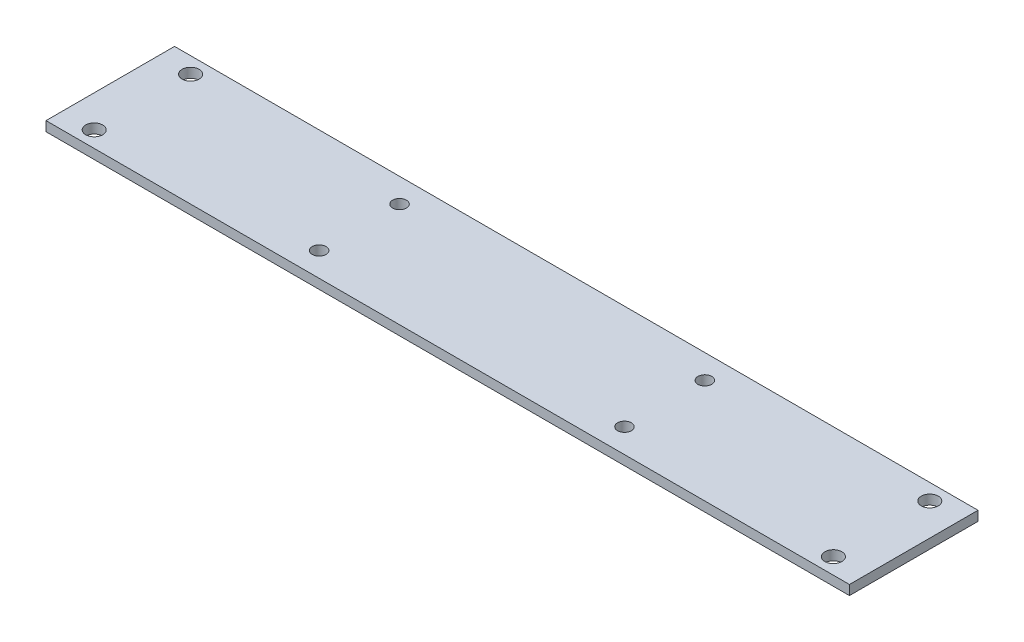
ISO-10303-21;
HEADER;
FILE_DESCRIPTION(('STEP AP214'),'2;1');
FILE_NAME('part.step','',(''),(''),'','','');
FILE_SCHEMA(('AUTOMOTIVE_DESIGN { 1 0 10303 214 1 1 1 1 }'));
ENDSEC;
DATA;
#1=APPLICATION_CONTEXT('core data for automotive mechanical design processes');
#2=APPLICATION_PROTOCOL_DEFINITION('international standard','automotive_design',2000,#1);
#3=PRODUCT_CONTEXT('',#1,'mechanical');
#4=PRODUCT('Part','Part','',(#3));
#5=PRODUCT_RELATED_PRODUCT_CATEGORY('part','',(#4));
#6=PRODUCT_DEFINITION_FORMATION('','',#4);
#7=PRODUCT_DEFINITION_CONTEXT('part definition',#1,'design');
#8=PRODUCT_DEFINITION('design','',#6,#7);
#9=PRODUCT_DEFINITION_SHAPE('','',#8);
#10=(LENGTH_UNIT() NAMED_UNIT(*) SI_UNIT(.MILLI.,.METRE.));
#11=(NAMED_UNIT(*) PLANE_ANGLE_UNIT() SI_UNIT($,.RADIAN.));
#12=(NAMED_UNIT(*) SI_UNIT($,.STERADIAN.) SOLID_ANGLE_UNIT());
#13=UNCERTAINTY_MEASURE_WITH_UNIT(LENGTH_MEASURE(1.E-05),#10,'distance_accuracy_value','');
#14=(GEOMETRIC_REPRESENTATION_CONTEXT(3) GLOBAL_UNCERTAINTY_ASSIGNED_CONTEXT((#13)) GLOBAL_UNIT_ASSIGNED_CONTEXT((#10,
#11,#12)) REPRESENTATION_CONTEXT('',''));
#15=CARTESIAN_POINT('',(0.,0.,0.));
#16=DIRECTION('',(0.,0.,1.));
#17=DIRECTION('',(1.,0.,0.));
#18=AXIS2_PLACEMENT_3D('',#15,#16,#17);
#19=CARTESIAN_POINT('',(0.,3.,0.));
#20=DIRECTION('',(0.,1.,0.));
#21=DIRECTION('',(0.,0.,1.));
#22=AXIS2_PLACEMENT_3D('',#19,#20,#21);
#23=PLANE('',#22);
#24=CARTESIAN_POINT('',(-115.,3.,15.));
#25=DIRECTION('',(0.,1.,0.));
#26=DIRECTION('',(0.,0.,-1.));
#27=AXIS2_PLACEMENT_3D('',#24,#25,#26);
#28=CIRCLE('',#27,2.65);
#29=CARTESIAN_POINT('',(-115.,3.,12.35));
#30=VERTEX_POINT('',#29);
#31=EDGE_CURVE('E174',#30,#30,#28,.T.);
#32=ORIENTED_EDGE('',*,*,#31,.F.);
#33=EDGE_LOOP('',(#32));
#34=FACE_BOUND('',#33,.T.);
#35=CARTESIAN_POINT('',(-115.,3.,-15.));
#36=DIRECTION('',(0.,1.,0.));
#37=DIRECTION('',(0.,0.,1.));
#38=AXIS2_PLACEMENT_3D('',#35,#36,#37);
#39=CIRCLE('',#38,2.65);
#40=CARTESIAN_POINT('',(-115.,3.,-12.35));
#41=VERTEX_POINT('',#40);
#42=EDGE_CURVE('E158',#41,#41,#39,.T.);
#43=ORIENTED_EDGE('',*,*,#42,.F.);
#44=EDGE_LOOP('',(#43));
#45=FACE_BOUND('',#44,.T.);
#46=CARTESIAN_POINT('',(47.5,3.,12.5));
#47=DIRECTION('',(0.,1.,0.));
#48=DIRECTION('',(0.,0.,1.));
#49=AXIS2_PLACEMENT_3D('',#46,#47,#48);
#50=CIRCLE('',#49,2.15);
#51=CARTESIAN_POINT('',(47.5,3.,14.65));
#52=VERTEX_POINT('',#51);
#53=EDGE_CURVE('E142',#52,#52,#50,.T.);
#54=ORIENTED_EDGE('',*,*,#53,.F.);
#55=EDGE_LOOP('',(#54));
#56=FACE_BOUND('',#55,.T.);
#57=CARTESIAN_POINT('',(-47.5,3.,-12.5));
#58=DIRECTION('',(0.,1.,0.));
#59=DIRECTION('',(0.,0.,1.));
#60=AXIS2_PLACEMENT_3D('',#57,#58,#59);
#61=CIRCLE('',#60,2.15);
#62=CARTESIAN_POINT('',(-47.5,3.,-10.35));
#63=VERTEX_POINT('',#62);
#64=EDGE_CURVE('E112',#63,#63,#61,.T.);
#65=ORIENTED_EDGE('',*,*,#64,.F.);
#66=EDGE_LOOP('',(#65));
#67=FACE_BOUND('',#66,.T.);
#68=DIRECTION('',(0.,0.,-1.));
#69=VECTOR('',#68,1.);
#70=CARTESIAN_POINT('',(125.,3.,-20.));
#71=LINE('',#70,#69);
#72=CARTESIAN_POINT('',(125.,3.,20.));
#73=VERTEX_POINT('',#72);
#74=CARTESIAN_POINT('',(125.,3.,-20.));
#75=VERTEX_POINT('',#74);
#76=EDGE_CURVE('E92',#73,#75,#71,.T.);
#77=ORIENTED_EDGE('',*,*,#76,.T.);
#78=DIRECTION('',(-1.,0.,0.));
#79=VECTOR('',#78,1.);
#80=CARTESIAN_POINT('',(-125.,3.,-20.));
#81=LINE('',#80,#79);
#82=CARTESIAN_POINT('',(-125.,3.,-20.));
#83=VERTEX_POINT('',#82);
#84=EDGE_CURVE('E87',#75,#83,#81,.T.);
#85=ORIENTED_EDGE('',*,*,#84,.T.);
#86=DIRECTION('',(0.,0.,1.));
#87=VECTOR('',#86,1.);
#88=CARTESIAN_POINT('',(-125.,3.,-20.));
#89=LINE('',#88,#87);
#90=CARTESIAN_POINT('',(-125.,3.,20.));
#91=VERTEX_POINT('',#90);
#92=EDGE_CURVE('E90',#83,#91,#89,.T.);
#93=ORIENTED_EDGE('',*,*,#92,.T.);
#94=DIRECTION('',(1.,0.,0.));
#95=VECTOR('',#94,1.);
#96=CARTESIAN_POINT('',(-125.,3.,20.));
#97=LINE('',#96,#95);
#98=EDGE_CURVE('E57',#91,#73,#97,.T.);
#99=ORIENTED_EDGE('',*,*,#98,.T.);
#100=EDGE_LOOP('',(#77,#85,#93,#99));
#101=FACE_BOUND('',#100,.T.);
#102=CARTESIAN_POINT('',(47.5,3.,-12.5));
#103=DIRECTION('',(0.,1.,0.));
#104=DIRECTION('',(0.,0.,-1.));
#105=AXIS2_PLACEMENT_3D('',#102,#103,#104);
#106=CIRCLE('',#105,2.15);
#107=CARTESIAN_POINT('',(47.5,3.,-14.65));
#108=VERTEX_POINT('',#107);
#109=EDGE_CURVE('E134',#108,#108,#106,.T.);
#110=ORIENTED_EDGE('',*,*,#109,.F.);
#111=EDGE_LOOP('',(#110));
#112=FACE_BOUND('',#111,.T.);
#113=CARTESIAN_POINT('',(-47.5,3.,12.5));
#114=DIRECTION('',(0.,1.,0.));
#115=DIRECTION('',(0.,0.,-1.));
#116=AXIS2_PLACEMENT_3D('',#113,#114,#115);
#117=CIRCLE('',#116,2.15);
#118=CARTESIAN_POINT('',(-47.5,3.,10.35));
#119=VERTEX_POINT('',#118);
#120=EDGE_CURVE('E150',#119,#119,#117,.T.);
#121=ORIENTED_EDGE('',*,*,#120,.F.);
#122=EDGE_LOOP('',(#121));
#123=FACE_BOUND('',#122,.T.);
#124=CARTESIAN_POINT('',(115.,3.,-15.));
#125=DIRECTION('',(0.,1.,0.));
#126=DIRECTION('',(0.,0.,-1.));
#127=AXIS2_PLACEMENT_3D('',#124,#125,#126);
#128=CIRCLE('',#127,2.65);
#129=CARTESIAN_POINT('',(115.,3.,-17.65));
#130=VERTEX_POINT('',#129);
#131=EDGE_CURVE('E166',#130,#130,#128,.T.);
#132=ORIENTED_EDGE('',*,*,#131,.F.);
#133=EDGE_LOOP('',(#132));
#134=FACE_BOUND('',#133,.T.);
#135=CARTESIAN_POINT('',(115.,3.,15.));
#136=DIRECTION('',(0.,1.,0.));
#137=DIRECTION('',(0.,0.,1.));
#138=AXIS2_PLACEMENT_3D('',#135,#136,#137);
#139=CIRCLE('',#138,2.65);
#140=CARTESIAN_POINT('',(115.,3.,17.65));
#141=VERTEX_POINT('',#140);
#142=EDGE_CURVE('E182',#141,#141,#139,.T.);
#143=ORIENTED_EDGE('',*,*,#142,.F.);
#144=EDGE_LOOP('',(#143));
#145=FACE_BOUND('',#144,.T.);
#146=ADVANCED_FACE('F39',(#34,#45,#56,#67,#101,#112,#123,#134,#145),#23,.T.);
#147=CARTESIAN_POINT('',(0.,0.,0.));
#148=DIRECTION('',(0.,1.,0.));
#149=DIRECTION('',(0.,0.,1.));
#150=AXIS2_PLACEMENT_3D('',#147,#148,#149);
#151=PLANE('',#150);
#152=DIRECTION('',(0.,0.,-1.));
#153=VECTOR('',#152,1.);
#154=CARTESIAN_POINT('',(125.,0.,-20.));
#155=LINE('',#154,#153);
#156=CARTESIAN_POINT('',(125.,0.,20.));
#157=VERTEX_POINT('',#156);
#158=CARTESIAN_POINT('',(125.,0.,-20.));
#159=VERTEX_POINT('',#158);
#160=EDGE_CURVE('E108',#157,#159,#155,.T.);
#161=ORIENTED_EDGE('',*,*,#160,.F.);
#162=DIRECTION('',(1.,0.,0.));
#163=VECTOR('',#162,1.);
#164=CARTESIAN_POINT('',(-125.,0.,20.));
#165=LINE('',#164,#163);
#166=CARTESIAN_POINT('',(-125.,0.,20.));
#167=VERTEX_POINT('',#166);
#168=EDGE_CURVE('E80',#167,#157,#165,.T.);
#169=ORIENTED_EDGE('',*,*,#168,.F.);
#170=DIRECTION('',(0.,0.,1.));
#171=VECTOR('',#170,1.);
#172=CARTESIAN_POINT('',(-125.,0.,-20.));
#173=LINE('',#172,#171);
#174=CARTESIAN_POINT('',(-125.,0.,-20.));
#175=VERTEX_POINT('',#174);
#176=EDGE_CURVE('E74',#175,#167,#173,.T.);
#177=ORIENTED_EDGE('',*,*,#176,.F.);
#178=DIRECTION('',(-1.,0.,0.));
#179=VECTOR('',#178,1.);
#180=CARTESIAN_POINT('',(-125.,0.,-20.));
#181=LINE('',#180,#179);
#182=EDGE_CURVE('E97',#159,#175,#181,.T.);
#183=ORIENTED_EDGE('',*,*,#182,.F.);
#184=EDGE_LOOP('',(#161,#169,#177,#183));
#185=FACE_BOUND('',#184,.T.);
#186=CARTESIAN_POINT('',(-47.5,0.,-12.5));
#187=DIRECTION('',(0.,1.,0.));
#188=DIRECTION('',(0.,0.,1.));
#189=AXIS2_PLACEMENT_3D('',#186,#187,#188);
#190=CIRCLE('',#189,2.15);
#191=CARTESIAN_POINT('',(-47.5,0.,-10.35));
#192=VERTEX_POINT('',#191);
#193=EDGE_CURVE('E130',#192,#192,#190,.T.);
#194=ORIENTED_EDGE('',*,*,#193,.T.);
#195=EDGE_LOOP('',(#194));
#196=FACE_BOUND('',#195,.T.);
#197=CARTESIAN_POINT('',(47.5,0.,-12.5));
#198=DIRECTION('',(0.,1.,0.));
#199=DIRECTION('',(0.,0.,-1.));
#200=AXIS2_PLACEMENT_3D('',#197,#198,#199);
#201=CIRCLE('',#200,2.15);
#202=CARTESIAN_POINT('',(47.5,0.,-14.65));
#203=VERTEX_POINT('',#202);
#204=EDGE_CURVE('E138',#203,#203,#201,.T.);
#205=ORIENTED_EDGE('',*,*,#204,.T.);
#206=EDGE_LOOP('',(#205));
#207=FACE_BOUND('',#206,.T.);
#208=CARTESIAN_POINT('',(47.5,0.,12.5));
#209=DIRECTION('',(0.,1.,0.));
#210=DIRECTION('',(0.,0.,1.));
#211=AXIS2_PLACEMENT_3D('',#208,#209,#210);
#212=CIRCLE('',#211,2.15);
#213=CARTESIAN_POINT('',(47.5,0.,14.65));
#214=VERTEX_POINT('',#213);
#215=EDGE_CURVE('E146',#214,#214,#212,.T.);
#216=ORIENTED_EDGE('',*,*,#215,.T.);
#217=EDGE_LOOP('',(#216));
#218=FACE_BOUND('',#217,.T.);
#219=CARTESIAN_POINT('',(-47.5,0.,12.5));
#220=DIRECTION('',(0.,1.,0.));
#221=DIRECTION('',(0.,0.,-1.));
#222=AXIS2_PLACEMENT_3D('',#219,#220,#221);
#223=CIRCLE('',#222,2.15);
#224=CARTESIAN_POINT('',(-47.5,0.,10.35));
#225=VERTEX_POINT('',#224);
#226=EDGE_CURVE('E154',#225,#225,#223,.T.);
#227=ORIENTED_EDGE('',*,*,#226,.T.);
#228=EDGE_LOOP('',(#227));
#229=FACE_BOUND('',#228,.T.);
#230=CARTESIAN_POINT('',(-115.,0.,-15.));
#231=DIRECTION('',(0.,1.,0.));
#232=DIRECTION('',(0.,0.,1.));
#233=AXIS2_PLACEMENT_3D('',#230,#231,#232);
#234=CIRCLE('',#233,2.65);
#235=CARTESIAN_POINT('',(-115.,0.,-12.35));
#236=VERTEX_POINT('',#235);
#237=EDGE_CURVE('E162',#236,#236,#234,.T.);
#238=ORIENTED_EDGE('',*,*,#237,.T.);
#239=EDGE_LOOP('',(#238));
#240=FACE_BOUND('',#239,.T.);
#241=CARTESIAN_POINT('',(115.,0.,-15.));
#242=DIRECTION('',(0.,1.,0.));
#243=DIRECTION('',(0.,0.,-1.));
#244=AXIS2_PLACEMENT_3D('',#241,#242,#243);
#245=CIRCLE('',#244,2.65);
#246=CARTESIAN_POINT('',(115.,0.,-17.65));
#247=VERTEX_POINT('',#246);
#248=EDGE_CURVE('E170',#247,#247,#245,.T.);
#249=ORIENTED_EDGE('',*,*,#248,.T.);
#250=EDGE_LOOP('',(#249));
#251=FACE_BOUND('',#250,.T.);
#252=CARTESIAN_POINT('',(-115.,0.,15.));
#253=DIRECTION('',(0.,1.,0.));
#254=DIRECTION('',(0.,0.,-1.));
#255=AXIS2_PLACEMENT_3D('',#252,#253,#254);
#256=CIRCLE('',#255,2.65);
#257=CARTESIAN_POINT('',(-115.,0.,12.35));
#258=VERTEX_POINT('',#257);
#259=EDGE_CURVE('E178',#258,#258,#256,.T.);
#260=ORIENTED_EDGE('',*,*,#259,.T.);
#261=EDGE_LOOP('',(#260));
#262=FACE_BOUND('',#261,.T.);
#263=CARTESIAN_POINT('',(115.,0.,15.));
#264=DIRECTION('',(0.,1.,0.));
#265=DIRECTION('',(0.,0.,1.));
#266=AXIS2_PLACEMENT_3D('',#263,#264,#265);
#267=CIRCLE('',#266,2.65);
#268=CARTESIAN_POINT('',(115.,0.,17.65));
#269=VERTEX_POINT('',#268);
#270=EDGE_CURVE('E186',#269,#269,#267,.T.);
#271=ORIENTED_EDGE('',*,*,#270,.T.);
#272=EDGE_LOOP('',(#271));
#273=FACE_BOUND('',#272,.T.);
#274=ADVANCED_FACE('F125',(#185,#196,#207,#218,#229,#240,#251,#262,#273),#151,.F.);
#275=CARTESIAN_POINT('',(125.,3.,-20.));
#276=DIRECTION('',(-1.,0.,0.));
#277=DIRECTION('',(0.,0.,1.));
#278=AXIS2_PLACEMENT_3D('',#275,#276,#277);
#279=PLANE('',#278);
#280=ORIENTED_EDGE('',*,*,#160,.T.);
#281=DIRECTION('',(0.,-1.,0.));
#282=VECTOR('',#281,1.);
#283=CARTESIAN_POINT('',(125.,3.,-20.));
#284=LINE('',#283,#282);
#285=EDGE_CURVE('E11',#75,#159,#284,.T.);
#286=ORIENTED_EDGE('',*,*,#285,.F.);
#287=ORIENTED_EDGE('',*,*,#76,.F.);
#288=DIRECTION('',(0.,-1.,0.));
#289=VECTOR('',#288,1.);
#290=CARTESIAN_POINT('',(125.,3.,20.));
#291=LINE('',#290,#289);
#292=EDGE_CURVE('E104',#73,#157,#291,.T.);
#293=ORIENTED_EDGE('',*,*,#292,.T.);
#294=EDGE_LOOP('',(#280,#286,#287,#293));
#295=FACE_BOUND('',#294,.T.);
#296=ADVANCED_FACE('F41',(#295),#279,.F.);
#297=CARTESIAN_POINT('',(-125.,3.,-20.));
#298=DIRECTION('',(0.,0.,1.));
#299=DIRECTION('',(1.,0.,0.));
#300=AXIS2_PLACEMENT_3D('',#297,#298,#299);
#301=PLANE('',#300);
#302=ORIENTED_EDGE('',*,*,#182,.T.);
#303=DIRECTION('',(0.,-1.,0.));
#304=VECTOR('',#303,1.);
#305=CARTESIAN_POINT('',(-125.,3.,-20.));
#306=LINE('',#305,#304);
#307=EDGE_CURVE('E49',#83,#175,#306,.T.);
#308=ORIENTED_EDGE('',*,*,#307,.F.);
#309=ORIENTED_EDGE('',*,*,#84,.F.);
#310=ORIENTED_EDGE('',*,*,#285,.T.);
#311=EDGE_LOOP('',(#302,#308,#309,#310));
#312=FACE_BOUND('',#311,.T.);
#313=ADVANCED_FACE('F96',(#312),#301,.F.);
#314=CARTESIAN_POINT('',(-125.,3.,-20.));
#315=DIRECTION('',(1.,0.,0.));
#316=DIRECTION('',(0.,0.,-1.));
#317=AXIS2_PLACEMENT_3D('',#314,#315,#316);
#318=PLANE('',#317);
#319=ORIENTED_EDGE('',*,*,#176,.T.);
#320=DIRECTION('',(0.,-1.,0.));
#321=VECTOR('',#320,1.);
#322=CARTESIAN_POINT('',(-125.,3.,20.));
#323=LINE('',#322,#321);
#324=EDGE_CURVE('E99',#91,#167,#323,.T.);
#325=ORIENTED_EDGE('',*,*,#324,.F.);
#326=ORIENTED_EDGE('',*,*,#92,.F.);
#327=ORIENTED_EDGE('',*,*,#307,.T.);
#328=EDGE_LOOP('',(#319,#325,#326,#327));
#329=FACE_BOUND('',#328,.T.);
#330=ADVANCED_FACE('F100',(#329),#318,.F.);
#331=CARTESIAN_POINT('',(-125.,3.,20.));
#332=DIRECTION('',(0.,0.,-1.));
#333=DIRECTION('',(-1.,0.,0.));
#334=AXIS2_PLACEMENT_3D('',#331,#332,#333);
#335=PLANE('',#334);
#336=ORIENTED_EDGE('',*,*,#168,.T.);
#337=ORIENTED_EDGE('',*,*,#292,.F.);
#338=ORIENTED_EDGE('',*,*,#98,.F.);
#339=ORIENTED_EDGE('',*,*,#324,.T.);
#340=EDGE_LOOP('',(#336,#337,#338,#339));
#341=FACE_BOUND('',#340,.T.);
#342=ADVANCED_FACE('F122',(#341),#335,.F.);
#343=CARTESIAN_POINT('',(-47.5,3.,-12.5));
#344=DIRECTION('',(0.,-1.,0.));
#345=DIRECTION('',(0.,0.,-1.));
#346=AXIS2_PLACEMENT_3D('',#343,#344,#345);
#347=CYLINDRICAL_SURFACE('',#346,2.15);
#348=ORIENTED_EDGE('',*,*,#64,.T.);
#349=EDGE_LOOP('',(#348));
#350=FACE_BOUND('',#349,.T.);
#351=ORIENTED_EDGE('',*,*,#193,.F.);
#352=EDGE_LOOP('',(#351));
#353=FACE_BOUND('',#352,.T.);
#354=ADVANCED_FACE('F207',(#350,#353),#347,.F.);
#355=CARTESIAN_POINT('',(47.5,3.,-12.5));
#356=DIRECTION('',(0.,-1.,0.));
#357=DIRECTION('',(0.,0.,-1.));
#358=AXIS2_PLACEMENT_3D('',#355,#356,#357);
#359=CYLINDRICAL_SURFACE('',#358,2.15);
#360=ORIENTED_EDGE('',*,*,#109,.T.);
#361=EDGE_LOOP('',(#360));
#362=FACE_BOUND('',#361,.T.);
#363=ORIENTED_EDGE('',*,*,#204,.F.);
#364=EDGE_LOOP('',(#363));
#365=FACE_BOUND('',#364,.T.);
#366=ADVANCED_FACE('F253',(#362,#365),#359,.F.);
#367=CARTESIAN_POINT('',(47.5,3.,12.5));
#368=DIRECTION('',(0.,-1.,0.));
#369=DIRECTION('',(0.,0.,-1.));
#370=AXIS2_PLACEMENT_3D('',#367,#368,#369);
#371=CYLINDRICAL_SURFACE('',#370,2.15);
#372=ORIENTED_EDGE('',*,*,#53,.T.);
#373=EDGE_LOOP('',(#372));
#374=FACE_BOUND('',#373,.T.);
#375=ORIENTED_EDGE('',*,*,#215,.F.);
#376=EDGE_LOOP('',(#375));
#377=FACE_BOUND('',#376,.T.);
#378=ADVANCED_FACE('F261',(#374,#377),#371,.F.);
#379=CARTESIAN_POINT('',(-47.5,3.,12.5));
#380=DIRECTION('',(0.,-1.,0.));
#381=DIRECTION('',(0.,0.,-1.));
#382=AXIS2_PLACEMENT_3D('',#379,#380,#381);
#383=CYLINDRICAL_SURFACE('',#382,2.15);
#384=ORIENTED_EDGE('',*,*,#120,.T.);
#385=EDGE_LOOP('',(#384));
#386=FACE_BOUND('',#385,.T.);
#387=ORIENTED_EDGE('',*,*,#226,.F.);
#388=EDGE_LOOP('',(#387));
#389=FACE_BOUND('',#388,.T.);
#390=ADVANCED_FACE('F269',(#386,#389),#383,.F.);
#391=CARTESIAN_POINT('',(-115.,3.,-15.));
#392=DIRECTION('',(0.,-1.,0.));
#393=DIRECTION('',(0.,0.,-1.));
#394=AXIS2_PLACEMENT_3D('',#391,#392,#393);
#395=CYLINDRICAL_SURFACE('',#394,2.65);
#396=ORIENTED_EDGE('',*,*,#42,.T.);
#397=EDGE_LOOP('',(#396));
#398=FACE_BOUND('',#397,.T.);
#399=ORIENTED_EDGE('',*,*,#237,.F.);
#400=EDGE_LOOP('',(#399));
#401=FACE_BOUND('',#400,.T.);
#402=ADVANCED_FACE('F278',(#398,#401),#395,.F.);
#403=CARTESIAN_POINT('',(115.,3.,-15.));
#404=DIRECTION('',(0.,-1.,0.));
#405=DIRECTION('',(0.,0.,-1.));
#406=AXIS2_PLACEMENT_3D('',#403,#404,#405);
#407=CYLINDRICAL_SURFACE('',#406,2.65);
#408=ORIENTED_EDGE('',*,*,#131,.T.);
#409=EDGE_LOOP('',(#408));
#410=FACE_BOUND('',#409,.T.);
#411=ORIENTED_EDGE('',*,*,#248,.F.);
#412=EDGE_LOOP('',(#411));
#413=FACE_BOUND('',#412,.T.);
#414=ADVANCED_FACE('F287',(#410,#413),#407,.F.);
#415=CARTESIAN_POINT('',(-115.,3.,15.));
#416=DIRECTION('',(0.,-1.,0.));
#417=DIRECTION('',(0.,0.,-1.));
#418=AXIS2_PLACEMENT_3D('',#415,#416,#417);
#419=CYLINDRICAL_SURFACE('',#418,2.65);
#420=ORIENTED_EDGE('',*,*,#31,.T.);
#421=EDGE_LOOP('',(#420));
#422=FACE_BOUND('',#421,.T.);
#423=ORIENTED_EDGE('',*,*,#259,.F.);
#424=EDGE_LOOP('',(#423));
#425=FACE_BOUND('',#424,.T.);
#426=ADVANCED_FACE('F296',(#422,#425),#419,.F.);
#427=CARTESIAN_POINT('',(115.,3.,15.));
#428=DIRECTION('',(0.,-1.,0.));
#429=DIRECTION('',(0.,0.,-1.));
#430=AXIS2_PLACEMENT_3D('',#427,#428,#429);
#431=CYLINDRICAL_SURFACE('',#430,2.65);
#432=ORIENTED_EDGE('',*,*,#142,.T.);
#433=EDGE_LOOP('',(#432));
#434=FACE_BOUND('',#433,.T.);
#435=ORIENTED_EDGE('',*,*,#270,.F.);
#436=EDGE_LOOP('',(#435));
#437=FACE_BOUND('',#436,.T.);
#438=ADVANCED_FACE('F194',(#434,#437),#431,.F.);
#439=CLOSED_SHELL('',(#146,#274,#296,#313,#330,#342,#354,#366,#378,#390,#402,#414,#426,#438));
#440=MANIFOLD_SOLID_BREP('B2',#439);
#441=ADVANCED_BREP_SHAPE_REPRESENTATION('',(#18,#440),#14);
#442=SHAPE_DEFINITION_REPRESENTATION(#9,#441);
ENDSEC;
END-ISO-10303-21;
